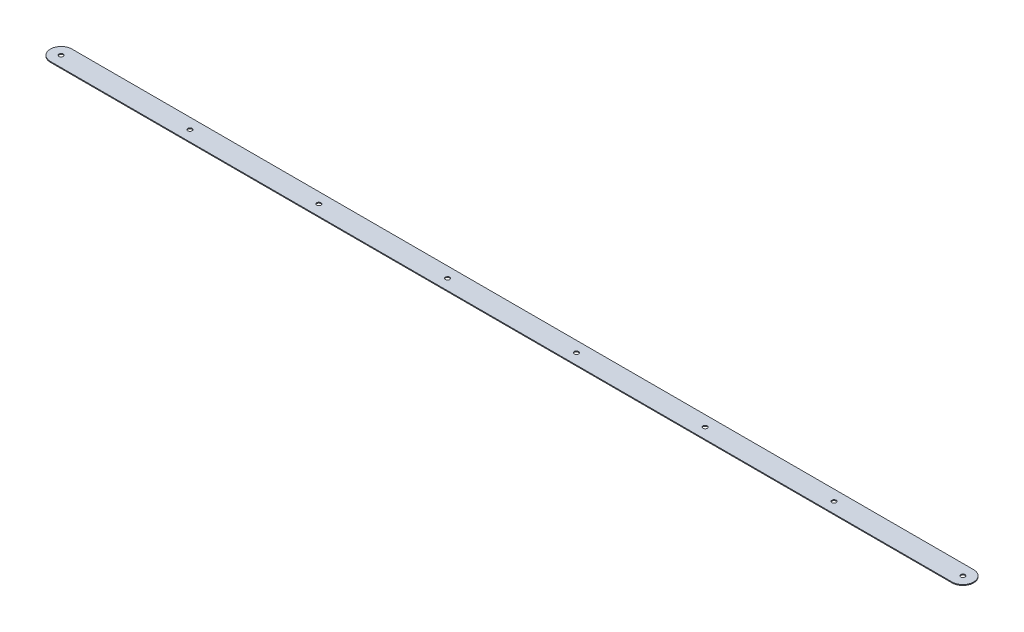
ISO-10303-21;
HEADER;
FILE_DESCRIPTION(('STEP AP214'),'2;1');
FILE_NAME('part.step','',(''),(''),'','','');
FILE_SCHEMA(('AUTOMOTIVE_DESIGN { 1 0 10303 214 1 1 1 1 }'));
ENDSEC;
DATA;
#1=APPLICATION_CONTEXT('core data for automotive mechanical design processes');
#2=APPLICATION_PROTOCOL_DEFINITION('international standard','automotive_design',2000,#1);
#3=PRODUCT_CONTEXT('',#1,'mechanical');
#4=PRODUCT('Part','Part','',(#3));
#5=PRODUCT_RELATED_PRODUCT_CATEGORY('part','',(#4));
#6=PRODUCT_DEFINITION_FORMATION('','',#4);
#7=PRODUCT_DEFINITION_CONTEXT('part definition',#1,'design');
#8=PRODUCT_DEFINITION('design','',#6,#7);
#9=PRODUCT_DEFINITION_SHAPE('','',#8);
#10=(LENGTH_UNIT() NAMED_UNIT(*) SI_UNIT(.MILLI.,.METRE.));
#11=(NAMED_UNIT(*) PLANE_ANGLE_UNIT() SI_UNIT($,.RADIAN.));
#12=(NAMED_UNIT(*) SI_UNIT($,.STERADIAN.) SOLID_ANGLE_UNIT());
#13=UNCERTAINTY_MEASURE_WITH_UNIT(LENGTH_MEASURE(1.E-05),#10,'distance_accuracy_value','');
#14=(GEOMETRIC_REPRESENTATION_CONTEXT(3) GLOBAL_UNCERTAINTY_ASSIGNED_CONTEXT((#13)) GLOBAL_UNIT_ASSIGNED_CONTEXT((#10,
#11,#12)) REPRESENTATION_CONTEXT('',''));
#15=CARTESIAN_POINT('',(0.,0.,0.));
#16=DIRECTION('',(0.,0.,1.));
#17=DIRECTION('',(1.,0.,0.));
#18=AXIS2_PLACEMENT_3D('',#15,#16,#17);
#19=CARTESIAN_POINT('',(0.,1.,0.));
#20=DIRECTION('',(0.,1.,0.));
#21=DIRECTION('',(0.,0.,1.));
#22=AXIS2_PLACEMENT_3D('',#19,#20,#21);
#23=PLANE('',#22);
#24=CARTESIAN_POINT('',(900.,1.,0.));
#25=DIRECTION('',(0.,1.,0.));
#26=DIRECTION('',(0.,0.,1.));
#27=AXIS2_PLACEMENT_3D('',#24,#25,#26);
#28=CIRCLE('',#27,2.50000000000002);
#29=CARTESIAN_POINT('',(900.,1.,2.50000000000002));
#30=VERTEX_POINT('',#29);
#31=EDGE_CURVE('E145',#30,#30,#28,.T.);
#32=ORIENTED_EDGE('',*,*,#31,.F.);
#33=EDGE_LOOP('',(#32));
#34=FACE_BOUND('',#33,.T.);
#35=CARTESIAN_POINT('',(600.,1.,0.));
#36=DIRECTION('',(0.,1.,0.));
#37=DIRECTION('',(0.,0.,1.));
#38=AXIS2_PLACEMENT_3D('',#35,#36,#37);
#39=CIRCLE('',#38,2.50000000000002);
#40=CARTESIAN_POINT('',(600.,1.,2.50000000000002));
#41=VERTEX_POINT('',#40);
#42=EDGE_CURVE('E133',#41,#41,#39,.T.);
#43=ORIENTED_EDGE('',*,*,#42,.F.);
#44=EDGE_LOOP('',(#43));
#45=FACE_BOUND('',#44,.T.);
#46=CARTESIAN_POINT('',(300.,1.,0.));
#47=DIRECTION('',(0.,1.,0.));
#48=DIRECTION('',(0.,0.,1.));
#49=AXIS2_PLACEMENT_3D('',#46,#47,#48);
#50=CIRCLE('',#49,2.50000000000002);
#51=CARTESIAN_POINT('',(300.,1.,2.50000000000002));
#52=VERTEX_POINT('',#51);
#53=EDGE_CURVE('E121',#52,#52,#50,.T.);
#54=ORIENTED_EDGE('',*,*,#53,.F.);
#55=EDGE_LOOP('',(#54));
#56=FACE_BOUND('',#55,.T.);
#57=CARTESIAN_POINT('',(0.,1.,0.));
#58=DIRECTION('',(0.,1.,0.));
#59=DIRECTION('',(0.,0.,1.));
#60=AXIS2_PLACEMENT_3D('',#57,#58,#59);
#61=CIRCLE('',#60,2.5);
#62=CARTESIAN_POINT('',(0.,1.,2.5));
#63=VERTEX_POINT('',#62);
#64=EDGE_CURVE('E100',#63,#63,#61,.T.);
#65=ORIENTED_EDGE('',*,*,#64,.F.);
#66=EDGE_LOOP('',(#65));
#67=FACE_BOUND('',#66,.T.);
#68=CARTESIAN_POINT('',(0.,1.,0.));
#69=DIRECTION('',(0.,1.,0.));
#70=DIRECTION('',(0.,0.,1.));
#71=AXIS2_PLACEMENT_3D('',#68,#69,#70);
#72=CIRCLE('',#71,12.5);
#73=CARTESIAN_POINT('',(0.,1.,-12.5));
#74=VERTEX_POINT('',#73);
#75=CARTESIAN_POINT('',(0.,1.,12.5));
#76=VERTEX_POINT('',#75);
#77=EDGE_CURVE('E85',#74,#76,#72,.T.);
#78=ORIENTED_EDGE('',*,*,#77,.T.);
#79=DIRECTION('',(1.,0.,0.));
#80=VECTOR('',#79,1.);
#81=CARTESIAN_POINT('',(0.,1.,12.5));
#82=LINE('',#81,#80);
#83=CARTESIAN_POINT('',(1050.,1.,12.5));
#84=VERTEX_POINT('',#83);
#85=EDGE_CURVE('E80',#76,#84,#82,.T.);
#86=ORIENTED_EDGE('',*,*,#85,.T.);
#87=CARTESIAN_POINT('',(1050.,1.,0.));
#88=DIRECTION('',(0.,1.,0.));
#89=DIRECTION('',(0.,0.,1.));
#90=AXIS2_PLACEMENT_3D('',#87,#88,#89);
#91=CIRCLE('',#90,12.5);
#92=CARTESIAN_POINT('',(1050.,1.,-12.5000000000002));
#93=VERTEX_POINT('',#92);
#94=EDGE_CURVE('E83',#84,#93,#91,.T.);
#95=ORIENTED_EDGE('',*,*,#94,.T.);
#96=DIRECTION('',(-1.,0.,0.));
#97=VECTOR('',#96,1.);
#98=CARTESIAN_POINT('',(0.,1.,-12.5));
#99=LINE('',#98,#97);
#100=EDGE_CURVE('E50',#93,#74,#99,.T.);
#101=ORIENTED_EDGE('',*,*,#100,.T.);
#102=EDGE_LOOP('',(#78,#86,#95,#101));
#103=FACE_BOUND('',#102,.T.);
#104=CARTESIAN_POINT('',(150.,1.,0.));
#105=DIRECTION('',(0.,1.,0.));
#106=DIRECTION('',(0.,0.,1.));
#107=AXIS2_PLACEMENT_3D('',#104,#105,#106);
#108=CIRCLE('',#107,2.5);
#109=CARTESIAN_POINT('',(150.,1.,2.5));
#110=VERTEX_POINT('',#109);
#111=EDGE_CURVE('E115',#110,#110,#108,.T.);
#112=ORIENTED_EDGE('',*,*,#111,.F.);
#113=EDGE_LOOP('',(#112));
#114=FACE_BOUND('',#113,.T.);
#115=CARTESIAN_POINT('',(450.,1.,0.));
#116=DIRECTION('',(0.,1.,0.));
#117=DIRECTION('',(0.,0.,1.));
#118=AXIS2_PLACEMENT_3D('',#115,#116,#117);
#119=CIRCLE('',#118,2.50000000000002);
#120=CARTESIAN_POINT('',(450.,1.,2.50000000000002));
#121=VERTEX_POINT('',#120);
#122=EDGE_CURVE('E127',#121,#121,#119,.T.);
#123=ORIENTED_EDGE('',*,*,#122,.F.);
#124=EDGE_LOOP('',(#123));
#125=FACE_BOUND('',#124,.T.);
#126=CARTESIAN_POINT('',(750.,1.,0.));
#127=DIRECTION('',(0.,1.,0.));
#128=DIRECTION('',(0.,0.,1.));
#129=AXIS2_PLACEMENT_3D('',#126,#127,#128);
#130=CIRCLE('',#129,2.50000000000002);
#131=CARTESIAN_POINT('',(750.,1.,2.50000000000002));
#132=VERTEX_POINT('',#131);
#133=EDGE_CURVE('E139',#132,#132,#130,.T.);
#134=ORIENTED_EDGE('',*,*,#133,.F.);
#135=EDGE_LOOP('',(#134));
#136=FACE_BOUND('',#135,.T.);
#137=CARTESIAN_POINT('',(1050.,1.,0.));
#138=DIRECTION('',(0.,1.,0.));
#139=DIRECTION('',(0.,0.,1.));
#140=AXIS2_PLACEMENT_3D('',#137,#138,#139);
#141=CIRCLE('',#140,2.49999999999992);
#142=CARTESIAN_POINT('',(1050.,1.,2.49999999999992));
#143=VERTEX_POINT('',#142);
#144=EDGE_CURVE('E151',#143,#143,#141,.T.);
#145=ORIENTED_EDGE('',*,*,#144,.F.);
#146=EDGE_LOOP('',(#145));
#147=FACE_BOUND('',#146,.T.);
#148=ADVANCED_FACE('F33',(#34,#45,#56,#67,#103,#114,#125,#136,#147),#23,.T.);
#149=CARTESIAN_POINT('',(0.,0.,0.));
#150=DIRECTION('',(0.,1.,0.));
#151=DIRECTION('',(0.,0.,1.));
#152=AXIS2_PLACEMENT_3D('',#149,#150,#151);
#153=PLANE('',#152);
#154=CARTESIAN_POINT('',(0.,0.,0.));
#155=DIRECTION('',(0.,1.,0.));
#156=DIRECTION('',(0.,0.,1.));
#157=AXIS2_PLACEMENT_3D('',#154,#155,#156);
#158=CIRCLE('',#157,12.5);
#159=CARTESIAN_POINT('',(0.,0.,-12.5));
#160=VERTEX_POINT('',#159);
#161=CARTESIAN_POINT('',(0.,0.,12.5));
#162=VERTEX_POINT('',#161);
#163=EDGE_CURVE('E97',#160,#162,#158,.T.);
#164=ORIENTED_EDGE('',*,*,#163,.F.);
#165=DIRECTION('',(-1.,0.,0.));
#166=VECTOR('',#165,1.);
#167=CARTESIAN_POINT('',(0.,0.,-12.5));
#168=LINE('',#167,#166);
#169=CARTESIAN_POINT('',(1050.,0.,-12.5000000000002));
#170=VERTEX_POINT('',#169);
#171=EDGE_CURVE('E73',#170,#160,#168,.T.);
#172=ORIENTED_EDGE('',*,*,#171,.F.);
#173=CARTESIAN_POINT('',(1050.,0.,0.));
#174=DIRECTION('',(0.,1.,0.));
#175=DIRECTION('',(0.,0.,1.));
#176=AXIS2_PLACEMENT_3D('',#173,#174,#175);
#177=CIRCLE('',#176,12.5);
#178=CARTESIAN_POINT('',(1050.,0.,12.5));
#179=VERTEX_POINT('',#178);
#180=EDGE_CURVE('E67',#179,#170,#177,.T.);
#181=ORIENTED_EDGE('',*,*,#180,.F.);
#182=DIRECTION('',(1.,0.,0.));
#183=VECTOR('',#182,1.);
#184=CARTESIAN_POINT('',(0.,0.,12.5));
#185=LINE('',#184,#183);
#186=EDGE_CURVE('E89',#162,#179,#185,.T.);
#187=ORIENTED_EDGE('',*,*,#186,.F.);
#188=EDGE_LOOP('',(#164,#172,#181,#187));
#189=FACE_BOUND('',#188,.T.);
#190=CARTESIAN_POINT('',(0.,0.,0.));
#191=DIRECTION('',(0.,1.,0.));
#192=DIRECTION('',(0.,0.,1.));
#193=AXIS2_PLACEMENT_3D('',#190,#191,#192);
#194=CIRCLE('',#193,2.5);
#195=CARTESIAN_POINT('',(0.,0.,2.5));
#196=VERTEX_POINT('',#195);
#197=EDGE_CURVE('E112',#196,#196,#194,.T.);
#198=ORIENTED_EDGE('',*,*,#197,.T.);
#199=EDGE_LOOP('',(#198));
#200=FACE_BOUND('',#199,.T.);
#201=CARTESIAN_POINT('',(150.,0.,0.));
#202=DIRECTION('',(0.,1.,0.));
#203=DIRECTION('',(0.,0.,1.));
#204=AXIS2_PLACEMENT_3D('',#201,#202,#203);
#205=CIRCLE('',#204,2.5);
#206=CARTESIAN_POINT('',(150.,0.,2.5));
#207=VERTEX_POINT('',#206);
#208=EDGE_CURVE('E118',#207,#207,#205,.T.);
#209=ORIENTED_EDGE('',*,*,#208,.T.);
#210=EDGE_LOOP('',(#209));
#211=FACE_BOUND('',#210,.T.);
#212=CARTESIAN_POINT('',(300.,0.,0.));
#213=DIRECTION('',(0.,1.,0.));
#214=DIRECTION('',(0.,0.,1.));
#215=AXIS2_PLACEMENT_3D('',#212,#213,#214);
#216=CIRCLE('',#215,2.50000000000002);
#217=CARTESIAN_POINT('',(300.,0.,2.50000000000002));
#218=VERTEX_POINT('',#217);
#219=EDGE_CURVE('E124',#218,#218,#216,.T.);
#220=ORIENTED_EDGE('',*,*,#219,.T.);
#221=EDGE_LOOP('',(#220));
#222=FACE_BOUND('',#221,.T.);
#223=CARTESIAN_POINT('',(450.,0.,0.));
#224=DIRECTION('',(0.,1.,0.));
#225=DIRECTION('',(0.,0.,1.));
#226=AXIS2_PLACEMENT_3D('',#223,#224,#225);
#227=CIRCLE('',#226,2.50000000000002);
#228=CARTESIAN_POINT('',(450.,0.,2.50000000000002));
#229=VERTEX_POINT('',#228);
#230=EDGE_CURVE('E130',#229,#229,#227,.T.);
#231=ORIENTED_EDGE('',*,*,#230,.T.);
#232=EDGE_LOOP('',(#231));
#233=FACE_BOUND('',#232,.T.);
#234=CARTESIAN_POINT('',(600.,0.,0.));
#235=DIRECTION('',(0.,1.,0.));
#236=DIRECTION('',(0.,0.,1.));
#237=AXIS2_PLACEMENT_3D('',#234,#235,#236);
#238=CIRCLE('',#237,2.50000000000002);
#239=CARTESIAN_POINT('',(600.,0.,2.50000000000002));
#240=VERTEX_POINT('',#239);
#241=EDGE_CURVE('E136',#240,#240,#238,.T.);
#242=ORIENTED_EDGE('',*,*,#241,.T.);
#243=EDGE_LOOP('',(#242));
#244=FACE_BOUND('',#243,.T.);
#245=CARTESIAN_POINT('',(750.,0.,0.));
#246=DIRECTION('',(0.,1.,0.));
#247=DIRECTION('',(0.,0.,1.));
#248=AXIS2_PLACEMENT_3D('',#245,#246,#247);
#249=CIRCLE('',#248,2.50000000000002);
#250=CARTESIAN_POINT('',(750.,0.,2.50000000000002));
#251=VERTEX_POINT('',#250);
#252=EDGE_CURVE('E142',#251,#251,#249,.T.);
#253=ORIENTED_EDGE('',*,*,#252,.T.);
#254=EDGE_LOOP('',(#253));
#255=FACE_BOUND('',#254,.T.);
#256=CARTESIAN_POINT('',(900.,0.,0.));
#257=DIRECTION('',(0.,1.,0.));
#258=DIRECTION('',(0.,0.,1.));
#259=AXIS2_PLACEMENT_3D('',#256,#257,#258);
#260=CIRCLE('',#259,2.50000000000002);
#261=CARTESIAN_POINT('',(900.,0.,2.50000000000002));
#262=VERTEX_POINT('',#261);
#263=EDGE_CURVE('E148',#262,#262,#260,.T.);
#264=ORIENTED_EDGE('',*,*,#263,.T.);
#265=EDGE_LOOP('',(#264));
#266=FACE_BOUND('',#265,.T.);
#267=CARTESIAN_POINT('',(1050.,0.,0.));
#268=DIRECTION('',(0.,1.,0.));
#269=DIRECTION('',(0.,0.,1.));
#270=AXIS2_PLACEMENT_3D('',#267,#268,#269);
#271=CIRCLE('',#270,2.49999999999992);
#272=CARTESIAN_POINT('',(1050.,0.,2.49999999999992));
#273=VERTEX_POINT('',#272);
#274=EDGE_CURVE('E154',#273,#273,#271,.T.);
#275=ORIENTED_EDGE('',*,*,#274,.T.);
#276=EDGE_LOOP('',(#275));
#277=FACE_BOUND('',#276,.T.);
#278=ADVANCED_FACE('F108',(#189,#200,#211,#222,#233,#244,#255,#266,#277),#153,.F.);
#279=CARTESIAN_POINT('',(0.,1.,0.));
#280=DIRECTION('',(0.,-1.,0.));
#281=DIRECTION('',(0.,0.,-1.));
#282=AXIS2_PLACEMENT_3D('',#279,#280,#281);
#283=CYLINDRICAL_SURFACE('',#282,12.5);
#284=ORIENTED_EDGE('',*,*,#163,.T.);
#285=DIRECTION('',(0.,-1.,0.));
#286=VECTOR('',#285,1.);
#287=CARTESIAN_POINT('',(0.,1.,12.5));
#288=LINE('',#287,#286);
#289=EDGE_CURVE('E11',#76,#162,#288,.T.);
#290=ORIENTED_EDGE('',*,*,#289,.F.);
#291=ORIENTED_EDGE('',*,*,#77,.F.);
#292=DIRECTION('',(0.,-1.,0.));
#293=VECTOR('',#292,1.);
#294=CARTESIAN_POINT('',(0.,1.,-12.5));
#295=LINE('',#294,#293);
#296=EDGE_CURVE('E93',#74,#160,#295,.T.);
#297=ORIENTED_EDGE('',*,*,#296,.T.);
#298=EDGE_LOOP('',(#284,#290,#291,#297));
#299=FACE_BOUND('',#298,.T.);
#300=ADVANCED_FACE('F35',(#299),#283,.T.);
#301=CARTESIAN_POINT('',(0.,1.,12.5));
#302=DIRECTION('',(0.,0.,-1.));
#303=DIRECTION('',(-1.,0.,0.));
#304=AXIS2_PLACEMENT_3D('',#301,#302,#303);
#305=PLANE('',#304);
#306=ORIENTED_EDGE('',*,*,#186,.T.);
#307=DIRECTION('',(0.,-1.,0.));
#308=VECTOR('',#307,1.);
#309=CARTESIAN_POINT('',(1050.,1.,12.5));
#310=LINE('',#309,#308);
#311=EDGE_CURVE('E42',#84,#179,#310,.T.);
#312=ORIENTED_EDGE('',*,*,#311,.F.);
#313=ORIENTED_EDGE('',*,*,#85,.F.);
#314=ORIENTED_EDGE('',*,*,#289,.T.);
#315=EDGE_LOOP('',(#306,#312,#313,#314));
#316=FACE_BOUND('',#315,.T.);
#317=ADVANCED_FACE('F88',(#316),#305,.F.);
#318=CARTESIAN_POINT('',(1050.,1.,0.));
#319=DIRECTION('',(0.,-1.,0.));
#320=DIRECTION('',(0.,0.,-1.));
#321=AXIS2_PLACEMENT_3D('',#318,#319,#320);
#322=CYLINDRICAL_SURFACE('',#321,12.5);
#323=ORIENTED_EDGE('',*,*,#180,.T.);
#324=DIRECTION('',(0.,-1.,0.));
#325=VECTOR('',#324,1.);
#326=CARTESIAN_POINT('',(1050.,1.,-12.5000000000002));
#327=LINE('',#326,#325);
#328=EDGE_CURVE('E90',#93,#170,#327,.T.);
#329=ORIENTED_EDGE('',*,*,#328,.F.);
#330=ORIENTED_EDGE('',*,*,#94,.F.);
#331=ORIENTED_EDGE('',*,*,#311,.T.);
#332=EDGE_LOOP('',(#323,#329,#330,#331));
#333=FACE_BOUND('',#332,.T.);
#334=ADVANCED_FACE('F91',(#333),#322,.T.);
#335=CARTESIAN_POINT('',(0.,1.,-12.5));
#336=DIRECTION('',(0.,0.,1.));
#337=DIRECTION('',(1.,0.,0.));
#338=AXIS2_PLACEMENT_3D('',#335,#336,#337);
#339=PLANE('',#338);
#340=ORIENTED_EDGE('',*,*,#171,.T.);
#341=ORIENTED_EDGE('',*,*,#296,.F.);
#342=ORIENTED_EDGE('',*,*,#100,.F.);
#343=ORIENTED_EDGE('',*,*,#328,.T.);
#344=EDGE_LOOP('',(#340,#341,#342,#343));
#345=FACE_BOUND('',#344,.T.);
#346=ADVANCED_FACE('F105',(#345),#339,.F.);
#347=CARTESIAN_POINT('',(0.,1.,0.));
#348=DIRECTION('',(0.,-1.,0.));
#349=DIRECTION('',(0.,0.,-1.));
#350=AXIS2_PLACEMENT_3D('',#347,#348,#349);
#351=CYLINDRICAL_SURFACE('',#350,2.5);
#352=ORIENTED_EDGE('',*,*,#64,.T.);
#353=EDGE_LOOP('',(#352));
#354=FACE_BOUND('',#353,.T.);
#355=ORIENTED_EDGE('',*,*,#197,.F.);
#356=EDGE_LOOP('',(#355));
#357=FACE_BOUND('',#356,.T.);
#358=ADVANCED_FACE('F173',(#354,#357),#351,.F.);
#359=CARTESIAN_POINT('',(150.,1.,0.));
#360=DIRECTION('',(0.,-1.,0.));
#361=DIRECTION('',(0.,0.,-1.));
#362=AXIS2_PLACEMENT_3D('',#359,#360,#361);
#363=CYLINDRICAL_SURFACE('',#362,2.5);
#364=ORIENTED_EDGE('',*,*,#111,.T.);
#365=EDGE_LOOP('',(#364));
#366=FACE_BOUND('',#365,.T.);
#367=ORIENTED_EDGE('',*,*,#208,.F.);
#368=EDGE_LOOP('',(#367));
#369=FACE_BOUND('',#368,.T.);
#370=ADVANCED_FACE('F219',(#366,#369),#363,.F.);
#371=CARTESIAN_POINT('',(300.,1.,0.));
#372=DIRECTION('',(0.,-1.,0.));
#373=DIRECTION('',(0.,0.,-1.));
#374=AXIS2_PLACEMENT_3D('',#371,#372,#373);
#375=CYLINDRICAL_SURFACE('',#374,2.50000000000002);
#376=ORIENTED_EDGE('',*,*,#53,.T.);
#377=EDGE_LOOP('',(#376));
#378=FACE_BOUND('',#377,.T.);
#379=ORIENTED_EDGE('',*,*,#219,.F.);
#380=EDGE_LOOP('',(#379));
#381=FACE_BOUND('',#380,.T.);
#382=ADVANCED_FACE('F227',(#378,#381),#375,.F.);
#383=CARTESIAN_POINT('',(450.,1.,0.));
#384=DIRECTION('',(0.,-1.,0.));
#385=DIRECTION('',(0.,0.,-1.));
#386=AXIS2_PLACEMENT_3D('',#383,#384,#385);
#387=CYLINDRICAL_SURFACE('',#386,2.50000000000002);
#388=ORIENTED_EDGE('',*,*,#122,.T.);
#389=EDGE_LOOP('',(#388));
#390=FACE_BOUND('',#389,.T.);
#391=ORIENTED_EDGE('',*,*,#230,.F.);
#392=EDGE_LOOP('',(#391));
#393=FACE_BOUND('',#392,.T.);
#394=ADVANCED_FACE('F235',(#390,#393),#387,.F.);
#395=CARTESIAN_POINT('',(600.,1.,0.));
#396=DIRECTION('',(0.,-1.,0.));
#397=DIRECTION('',(0.,0.,-1.));
#398=AXIS2_PLACEMENT_3D('',#395,#396,#397);
#399=CYLINDRICAL_SURFACE('',#398,2.50000000000002);
#400=ORIENTED_EDGE('',*,*,#42,.T.);
#401=EDGE_LOOP('',(#400));
#402=FACE_BOUND('',#401,.T.);
#403=ORIENTED_EDGE('',*,*,#241,.F.);
#404=EDGE_LOOP('',(#403));
#405=FACE_BOUND('',#404,.T.);
#406=ADVANCED_FACE('F244',(#402,#405),#399,.F.);
#407=CARTESIAN_POINT('',(750.,1.,0.));
#408=DIRECTION('',(0.,-1.,0.));
#409=DIRECTION('',(0.,0.,-1.));
#410=AXIS2_PLACEMENT_3D('',#407,#408,#409);
#411=CYLINDRICAL_SURFACE('',#410,2.50000000000002);
#412=ORIENTED_EDGE('',*,*,#133,.T.);
#413=EDGE_LOOP('',(#412));
#414=FACE_BOUND('',#413,.T.);
#415=ORIENTED_EDGE('',*,*,#252,.F.);
#416=EDGE_LOOP('',(#415));
#417=FACE_BOUND('',#416,.T.);
#418=ADVANCED_FACE('F253',(#414,#417),#411,.F.);
#419=CARTESIAN_POINT('',(900.,1.,0.));
#420=DIRECTION('',(0.,-1.,0.));
#421=DIRECTION('',(0.,0.,-1.));
#422=AXIS2_PLACEMENT_3D('',#419,#420,#421);
#423=CYLINDRICAL_SURFACE('',#422,2.50000000000002);
#424=ORIENTED_EDGE('',*,*,#31,.T.);
#425=EDGE_LOOP('',(#424));
#426=FACE_BOUND('',#425,.T.);
#427=ORIENTED_EDGE('',*,*,#263,.F.);
#428=EDGE_LOOP('',(#427));
#429=FACE_BOUND('',#428,.T.);
#430=ADVANCED_FACE('F262',(#426,#429),#423,.F.);
#431=CARTESIAN_POINT('',(1050.,1.,0.));
#432=DIRECTION('',(0.,-1.,0.));
#433=DIRECTION('',(0.,0.,-1.));
#434=AXIS2_PLACEMENT_3D('',#431,#432,#433);
#435=CYLINDRICAL_SURFACE('',#434,2.49999999999992);
#436=ORIENTED_EDGE('',*,*,#144,.T.);
#437=EDGE_LOOP('',(#436));
#438=FACE_BOUND('',#437,.T.);
#439=ORIENTED_EDGE('',*,*,#274,.F.);
#440=EDGE_LOOP('',(#439));
#441=FACE_BOUND('',#440,.T.);
#442=ADVANCED_FACE('F160',(#438,#441),#435,.F.);
#443=CLOSED_SHELL('',(#148,#278,#300,#317,#334,#346,#358,#370,#382,#394,#406,#418,#430,#442));
#444=MANIFOLD_SOLID_BREP('B2',#443);
#445=ADVANCED_BREP_SHAPE_REPRESENTATION('',(#18,#444),#14);
#446=SHAPE_DEFINITION_REPRESENTATION(#9,#445);
ENDSEC;
END-ISO-10303-21;
